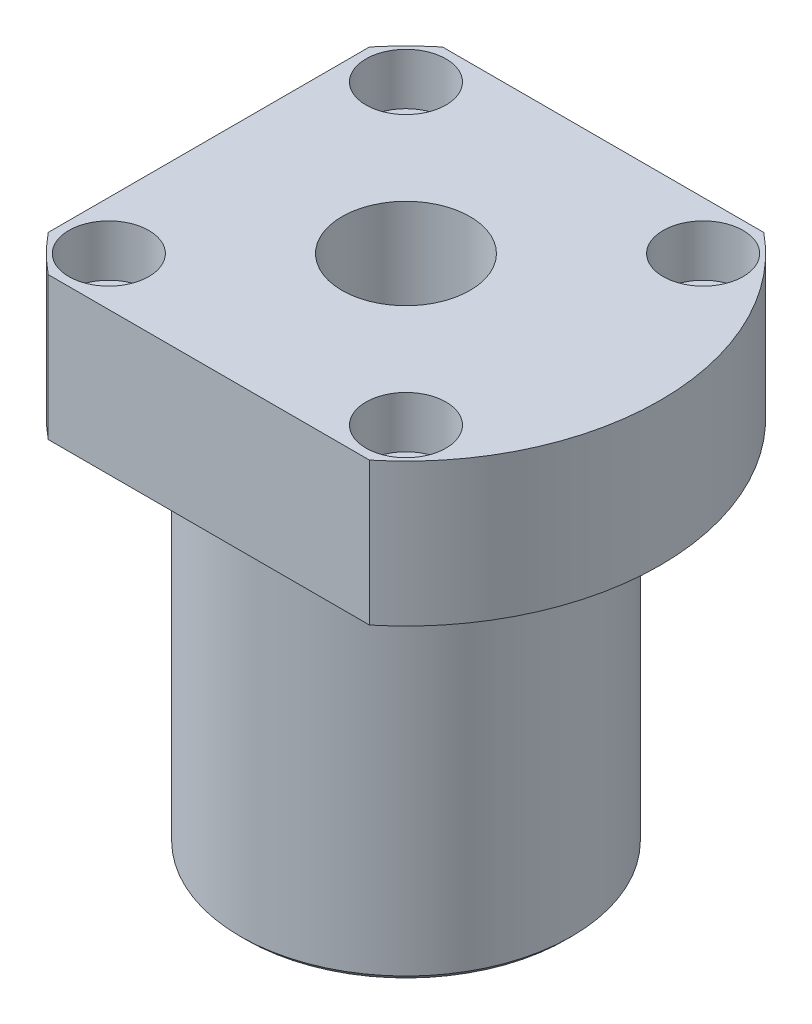
ISO-10303-21;
HEADER;
FILE_DESCRIPTION(('STEP AP214'),'2;1');
FILE_NAME('part.step','',(''),(''),'','','');
FILE_SCHEMA(('AUTOMOTIVE_DESIGN { 1 0 10303 214 1 1 1 1 }'));
ENDSEC;
DATA;
#1=APPLICATION_CONTEXT('core data for automotive mechanical design processes');
#2=APPLICATION_PROTOCOL_DEFINITION('international standard','automotive_design',2000,#1);
#3=PRODUCT_CONTEXT('',#1,'mechanical');
#4=PRODUCT('Part','Part','',(#3));
#5=PRODUCT_RELATED_PRODUCT_CATEGORY('part','',(#4));
#6=PRODUCT_DEFINITION_FORMATION('','',#4);
#7=PRODUCT_DEFINITION_CONTEXT('part definition',#1,'design');
#8=PRODUCT_DEFINITION('design','',#6,#7);
#9=PRODUCT_DEFINITION_SHAPE('','',#8);
#10=(LENGTH_UNIT() NAMED_UNIT(*) SI_UNIT(.MILLI.,.METRE.));
#11=(NAMED_UNIT(*) PLANE_ANGLE_UNIT() SI_UNIT($,.RADIAN.));
#12=(NAMED_UNIT(*) SI_UNIT($,.STERADIAN.) SOLID_ANGLE_UNIT());
#13=UNCERTAINTY_MEASURE_WITH_UNIT(LENGTH_MEASURE(1.E-05),#10,'distance_accuracy_value','');
#14=(GEOMETRIC_REPRESENTATION_CONTEXT(3) GLOBAL_UNCERTAINTY_ASSIGNED_CONTEXT((#13)) GLOBAL_UNIT_ASSIGNED_CONTEXT((#10,
#11,#12)) REPRESENTATION_CONTEXT('',''));
#15=CARTESIAN_POINT('',(0.,0.,0.));
#16=DIRECTION('',(0.,0.,1.));
#17=DIRECTION('',(1.,0.,0.));
#18=AXIS2_PLACEMENT_3D('',#15,#16,#17);
#19=CARTESIAN_POINT('',(0.,-47.6,0.));
#20=DIRECTION('',(0.,1.,0.));
#21=DIRECTION('',(0.,0.,1.));
#22=AXIS2_PLACEMENT_3D('',#19,#20,#21);
#23=PLANE('',#22);
#24=CARTESIAN_POINT('',(0.,-47.6,0.));
#25=DIRECTION('',(0.,1.,0.));
#26=DIRECTION('',(0.,0.,1.));
#27=AXIS2_PLACEMENT_3D('',#24,#25,#26);
#28=CIRCLE('',#27,20.);
#29=CARTESIAN_POINT('',(0.,-47.6,20.));
#30=VERTEX_POINT('',#29);
#31=EDGE_CURVE('E20',#30,#30,#28,.T.);
#32=ORIENTED_EDGE('',*,*,#31,.T.);
#33=EDGE_LOOP('',(#32));
#34=FACE_BOUND('',#33,.T.);
#35=ADVANCED_FACE('F17',(#34),#23,.T.);
#36=CARTESIAN_POINT('',(0.,-51.23,0.));
#37=DIRECTION('',(0.,1.,0.));
#38=DIRECTION('',(0.,0.,1.));
#39=AXIS2_PLACEMENT_3D('',#36,#37,#38);
#40=CYLINDRICAL_SURFACE('',#39,20.);
#41=ORIENTED_EDGE('',*,*,#31,.F.);
#42=EDGE_LOOP('',(#41));
#43=FACE_BOUND('',#42,.T.);
#44=CARTESIAN_POINT('',(0.,3.,0.));
#45=DIRECTION('',(0.,1.,0.));
#46=DIRECTION('',(0.,0.,1.));
#47=AXIS2_PLACEMENT_3D('',#44,#45,#46);
#48=CIRCLE('',#47,20.);
#49=CARTESIAN_POINT('',(0.,3.,20.));
#50=VERTEX_POINT('',#49);
#51=EDGE_CURVE('E201',#50,#50,#48,.T.);
#52=ORIENTED_EDGE('',*,*,#51,.T.);
#53=EDGE_LOOP('',(#52));
#54=FACE_BOUND('',#53,.T.);
#55=ADVANCED_FACE('F209',(#43,#54),#40,.F.);
#56=CARTESIAN_POINT('',(0.,3.,0.));
#57=DIRECTION('',(0.,1.,0.));
#58=DIRECTION('',(0.,0.,1.));
#59=AXIS2_PLACEMENT_3D('',#56,#57,#58);
#60=PLANE('',#59);
#61=CARTESIAN_POINT('',(0.,3.,0.));
#62=DIRECTION('',(0.,1.,0.));
#63=DIRECTION('',(0.,0.,1.));
#64=AXIS2_PLACEMENT_3D('',#61,#62,#63);
#65=CIRCLE('',#64,11.2);
#66=CARTESIAN_POINT('',(0.,3.,11.2));
#67=VERTEX_POINT('',#66);
#68=EDGE_CURVE('E199',#67,#67,#65,.T.);
#69=ORIENTED_EDGE('',*,*,#68,.T.);
#70=EDGE_LOOP('',(#69));
#71=FACE_BOUND('',#70,.T.);
#72=ORIENTED_EDGE('',*,*,#51,.F.);
#73=EDGE_LOOP('',(#72));
#74=FACE_BOUND('',#73,.T.);
#75=ADVANCED_FACE('F211',(#71,#74),#60,.F.);
#76=CARTESIAN_POINT('',(34.5,10.,-13.));
#77=DIRECTION('',(0.,1.,0.));
#78=DIRECTION('',(0.,0.,1.));
#79=AXIS2_PLACEMENT_3D('',#76,#77,#78);
#80=PLANE('',#79);
#81=CARTESIAN_POINT('',(34.5,10.,-13.));
#82=DIRECTION('',(0.,1.,0.));
#83=DIRECTION('',(0.,0.,1.));
#84=AXIS2_PLACEMENT_3D('',#81,#82,#83);
#85=CIRCLE('',#84,2.);
#86=CARTESIAN_POINT('',(34.5,10.,-11.));
#87=VERTEX_POINT('',#86);
#88=EDGE_CURVE('E95',#87,#87,#85,.F.);
#89=ORIENTED_EDGE('',*,*,#88,.T.);
#90=EDGE_LOOP('',(#89));
#91=FACE_BOUND('',#90,.T.);
#92=ADVANCED_FACE('F218',(#91),#80,.F.);
#93=CARTESIAN_POINT('',(34.5,10.,13.));
#94=DIRECTION('',(0.,-1.,0.));
#95=DIRECTION('',(0.,0.,-1.));
#96=AXIS2_PLACEMENT_3D('',#93,#94,#95);
#97=PLANE('',#96);
#98=CARTESIAN_POINT('',(34.5,10.,13.));
#99=DIRECTION('',(0.,-1.,0.));
#100=DIRECTION('',(0.,0.,-1.));
#101=AXIS2_PLACEMENT_3D('',#98,#99,#100);
#102=CIRCLE('',#101,2.);
#103=CARTESIAN_POINT('',(34.5,10.,11.));
#104=VERTEX_POINT('',#103);
#105=EDGE_CURVE('E89',#104,#104,#102,.T.);
#106=ORIENTED_EDGE('',*,*,#105,.T.);
#107=EDGE_LOOP('',(#106));
#108=FACE_BOUND('',#107,.T.);
#109=ADVANCED_FACE('F82',(#108),#97,.T.);
#110=CARTESIAN_POINT('',(16.85,-58.4999999999241,0.));
#111=DIRECTION('',(0.,-1.,0.));
#112=DIRECTION('',(0.,0.,-1.));
#113=AXIS2_PLACEMENT_3D('',#110,#111,#112);
#114=CONICAL_SURFACE('',#113,1.99999999980546,1.04719755105914);
#115=CARTESIAN_POINT('',(16.8500000002041,-57.3452994615877,0.));
#116=VERTEX_POINT('',#115);
#117=VERTEX_LOOP('',#116);
#118=FACE_BOUND('',#117,.T.);
#119=CARTESIAN_POINT('',(16.85,-58.5,0.));
#120=DIRECTION('',(0.,1.,0.));
#121=DIRECTION('',(0.,0.,1.));
#122=AXIS2_PLACEMENT_3D('',#119,#120,#121);
#123=CIRCLE('',#122,2.);
#124=CARTESIAN_POINT('',(16.85,-58.5,2.));
#125=VERTEX_POINT('',#124);
#126=EDGE_CURVE('E86',#125,#125,#123,.F.);
#127=ORIENTED_EDGE('',*,*,#126,.T.);
#128=EDGE_LOOP('',(#127));
#129=FACE_BOUND('',#128,.T.);
#130=ADVANCED_FACE('F78',(#118,#129),#114,.F.);
#131=CARTESIAN_POINT('',(-16.85,-58.4999999999809,0.));
#132=DIRECTION('',(0.,-1.,0.));
#133=DIRECTION('',(0.,0.,-1.));
#134=AXIS2_PLACEMENT_3D('',#131,#132,#133);
#135=CONICAL_SURFACE('',#134,1.99999999992942,1.04719755102096);
#136=CARTESIAN_POINT('',(-16.85,-58.5,0.));
#137=DIRECTION('',(0.,-1.,0.));
#138=DIRECTION('',(0.,0.,-1.));
#139=AXIS2_PLACEMENT_3D('',#136,#137,#138);
#140=CIRCLE('',#139,2.);
#141=CARTESIAN_POINT('',(-16.85,-58.5,-2.));
#142=VERTEX_POINT('',#141);
#143=EDGE_CURVE('E88',#142,#142,#140,.T.);
#144=ORIENTED_EDGE('',*,*,#143,.T.);
#145=EDGE_LOOP('',(#144));
#146=FACE_BOUND('',#145,.T.);
#147=CARTESIAN_POINT('',(-16.850000000261,-57.3452994615593,0.));
#148=VERTEX_POINT('',#147);
#149=VERTEX_LOOP('',#148);
#150=FACE_BOUND('',#149,.T.);
#151=ADVANCED_FACE('F81',(#146,#150),#135,.F.);
#152=CARTESIAN_POINT('',(0.,-51.23,0.));
#153=DIRECTION('',(0.,1.,0.));
#154=DIRECTION('',(0.,0.,1.));
#155=AXIS2_PLACEMENT_3D('',#152,#153,#154);
#156=CYLINDRICAL_SURFACE('',#155,11.2);
#157=ORIENTED_EDGE('',*,*,#68,.F.);
#158=EDGE_LOOP('',(#157));
#159=FACE_BOUND('',#158,.T.);
#160=CARTESIAN_POINT('',(0.,25.,0.));
#161=DIRECTION('',(0.,1.,0.));
#162=DIRECTION('',(0.,0.,1.));
#163=AXIS2_PLACEMENT_3D('',#160,#161,#162);
#164=CIRCLE('',#163,11.2);
#165=CARTESIAN_POINT('',(0.,25.,11.2));
#166=VERTEX_POINT('',#165);
#167=EDGE_CURVE('E92',#166,#166,#164,.F.);
#168=ORIENTED_EDGE('',*,*,#167,.F.);
#169=EDGE_LOOP('',(#168));
#170=FACE_BOUND('',#169,.T.);
#171=ADVANCED_FACE('F348',(#159,#170),#156,.F.);
#172=CARTESIAN_POINT('',(26.,-1.25,26.));
#173=DIRECTION('',(0.,1.,0.));
#174=DIRECTION('',(0.,0.,1.));
#175=AXIS2_PLACEMENT_3D('',#172,#173,#174);
#176=CYLINDRICAL_SURFACE('',#175,7.);
#177=CARTESIAN_POINT('',(26.,16.,26.));
#178=DIRECTION('',(0.,1.,0.));
#179=DIRECTION('',(0.,0.,1.));
#180=AXIS2_PLACEMENT_3D('',#177,#178,#179);
#181=CIRCLE('',#180,7.);
#182=CARTESIAN_POINT('',(26.,16.,33.));
#183=VERTEX_POINT('',#182);
#184=EDGE_CURVE('E180',#183,#183,#181,.T.);
#185=ORIENTED_EDGE('',*,*,#184,.F.);
#186=EDGE_LOOP('',(#185));
#187=FACE_BOUND('',#186,.T.);
#188=CARTESIAN_POINT('',(26.,25.,26.));
#189=DIRECTION('',(0.,1.,0.));
#190=DIRECTION('',(0.,0.,1.));
#191=AXIS2_PLACEMENT_3D('',#188,#189,#190);
#192=CIRCLE('',#191,7.);
#193=CARTESIAN_POINT('',(26.,25.,33.));
#194=VERTEX_POINT('',#193);
#195=EDGE_CURVE('E192',#194,#194,#192,.F.);
#196=ORIENTED_EDGE('',*,*,#195,.F.);
#197=EDGE_LOOP('',(#196));
#198=FACE_BOUND('',#197,.T.);
#199=ADVANCED_FACE('F344',(#187,#198),#176,.F.);
#200=CARTESIAN_POINT('',(26.,-1.25,-26.));
#201=DIRECTION('',(0.,-1.,0.));
#202=DIRECTION('',(0.,0.,-1.));
#203=AXIS2_PLACEMENT_3D('',#200,#201,#202);
#204=CYLINDRICAL_SURFACE('',#203,7.);
#205=CARTESIAN_POINT('',(26.,16.,-26.));
#206=DIRECTION('',(0.,-1.,0.));
#207=DIRECTION('',(0.,0.,-1.));
#208=AXIS2_PLACEMENT_3D('',#205,#206,#207);
#209=CIRCLE('',#208,7.);
#210=CARTESIAN_POINT('',(26.,16.,-33.));
#211=VERTEX_POINT('',#210);
#212=EDGE_CURVE('E177',#211,#211,#209,.T.);
#213=ORIENTED_EDGE('',*,*,#212,.T.);
#214=EDGE_LOOP('',(#213));
#215=FACE_BOUND('',#214,.T.);
#216=CARTESIAN_POINT('',(26.,25.,-26.));
#217=DIRECTION('',(0.,-1.,0.));
#218=DIRECTION('',(0.,0.,-1.));
#219=AXIS2_PLACEMENT_3D('',#216,#217,#218);
#220=CIRCLE('',#219,7.);
#221=CARTESIAN_POINT('',(26.,25.,-33.));
#222=VERTEX_POINT('',#221);
#223=EDGE_CURVE('E189',#222,#222,#220,.T.);
#224=ORIENTED_EDGE('',*,*,#223,.F.);
#225=EDGE_LOOP('',(#224));
#226=FACE_BOUND('',#225,.T.);
#227=ADVANCED_FACE('F340',(#215,#226),#204,.F.);
#228=CARTESIAN_POINT('',(-26.,-1.25,26.));
#229=DIRECTION('',(0.,-1.,0.));
#230=DIRECTION('',(0.,0.,-1.));
#231=AXIS2_PLACEMENT_3D('',#228,#229,#230);
#232=CYLINDRICAL_SURFACE('',#231,7.);
#233=CARTESIAN_POINT('',(-26.,16.,26.));
#234=DIRECTION('',(0.,-1.,0.));
#235=DIRECTION('',(0.,0.,-1.));
#236=AXIS2_PLACEMENT_3D('',#233,#234,#235);
#237=CIRCLE('',#236,7.);
#238=CARTESIAN_POINT('',(-26.,16.,19.));
#239=VERTEX_POINT('',#238);
#240=EDGE_CURVE('E174',#239,#239,#237,.T.);
#241=ORIENTED_EDGE('',*,*,#240,.T.);
#242=EDGE_LOOP('',(#241));
#243=FACE_BOUND('',#242,.T.);
#244=CARTESIAN_POINT('',(-26.,25.,26.));
#245=DIRECTION('',(0.,-1.,0.));
#246=DIRECTION('',(0.,0.,-1.));
#247=AXIS2_PLACEMENT_3D('',#244,#245,#246);
#248=CIRCLE('',#247,7.);
#249=CARTESIAN_POINT('',(-26.,25.,19.));
#250=VERTEX_POINT('',#249);
#251=EDGE_CURVE('E186',#250,#250,#248,.T.);
#252=ORIENTED_EDGE('',*,*,#251,.F.);
#253=EDGE_LOOP('',(#252));
#254=FACE_BOUND('',#253,.T.);
#255=ADVANCED_FACE('F336',(#243,#254),#232,.F.);
#256=CARTESIAN_POINT('',(-26.,-1.25,-26.));
#257=DIRECTION('',(0.,1.,0.));
#258=DIRECTION('',(0.,0.,1.));
#259=AXIS2_PLACEMENT_3D('',#256,#257,#258);
#260=CYLINDRICAL_SURFACE('',#259,7.);
#261=CARTESIAN_POINT('',(-26.,16.,-26.));
#262=DIRECTION('',(0.,1.,0.));
#263=DIRECTION('',(0.,0.,1.));
#264=AXIS2_PLACEMENT_3D('',#261,#262,#263);
#265=CIRCLE('',#264,7.);
#266=CARTESIAN_POINT('',(-26.,16.,-19.));
#267=VERTEX_POINT('',#266);
#268=EDGE_CURVE('E171',#267,#267,#265,.T.);
#269=ORIENTED_EDGE('',*,*,#268,.F.);
#270=EDGE_LOOP('',(#269));
#271=FACE_BOUND('',#270,.T.);
#272=CARTESIAN_POINT('',(-26.,25.,-26.));
#273=DIRECTION('',(0.,1.,0.));
#274=DIRECTION('',(0.,0.,1.));
#275=AXIS2_PLACEMENT_3D('',#272,#273,#274);
#276=CIRCLE('',#275,7.);
#277=CARTESIAN_POINT('',(-26.,25.,-19.));
#278=VERTEX_POINT('',#277);
#279=EDGE_CURVE('E183',#278,#278,#276,.F.);
#280=ORIENTED_EDGE('',*,*,#279,.F.);
#281=EDGE_LOOP('',(#280));
#282=FACE_BOUND('',#281,.T.);
#283=ADVANCED_FACE('F332',(#271,#282),#260,.F.);
#284=CARTESIAN_POINT('',(34.5,-0.5,-13.));
#285=DIRECTION('',(0.,1.,0.));
#286=DIRECTION('',(0.,0.,1.));
#287=AXIS2_PLACEMENT_3D('',#284,#285,#286);
#288=CYLINDRICAL_SURFACE('',#287,2.);
#289=ORIENTED_EDGE('',*,*,#88,.F.);
#290=EDGE_LOOP('',(#289));
#291=FACE_BOUND('',#290,.T.);
#292=CARTESIAN_POINT('',(34.5,1.5,-13.));
#293=DIRECTION('',(0.,1.,0.));
#294=DIRECTION('',(0.,0.,1.));
#295=AXIS2_PLACEMENT_3D('',#292,#293,#294);
#296=CIRCLE('',#295,2.);
#297=CARTESIAN_POINT('',(34.5,1.5,-11.));
#298=VERTEX_POINT('',#297);
#299=EDGE_CURVE('E168',#298,#298,#296,.F.);
#300=ORIENTED_EDGE('',*,*,#299,.T.);
#301=EDGE_LOOP('',(#300));
#302=FACE_BOUND('',#301,.T.);
#303=ADVANCED_FACE('F328',(#291,#302),#288,.F.);
#304=CARTESIAN_POINT('',(34.5,-0.5,13.));
#305=DIRECTION('',(0.,-1.,0.));
#306=DIRECTION('',(0.,0.,-1.));
#307=AXIS2_PLACEMENT_3D('',#304,#305,#306);
#308=CYLINDRICAL_SURFACE('',#307,2.);
#309=ORIENTED_EDGE('',*,*,#105,.F.);
#310=EDGE_LOOP('',(#309));
#311=FACE_BOUND('',#310,.T.);
#312=CARTESIAN_POINT('',(34.5,1.5,13.));
#313=DIRECTION('',(0.,-1.,0.));
#314=DIRECTION('',(0.,0.,-1.));
#315=AXIS2_PLACEMENT_3D('',#312,#313,#314);
#316=CIRCLE('',#315,2.);
#317=CARTESIAN_POINT('',(34.5,1.5,11.));
#318=VERTEX_POINT('',#317);
#319=EDGE_CURVE('E165',#318,#318,#316,.F.);
#320=ORIENTED_EDGE('',*,*,#319,.F.);
#321=EDGE_LOOP('',(#320));
#322=FACE_BOUND('',#321,.T.);
#323=ADVANCED_FACE('F325',(#311,#322),#308,.F.);
#324=CARTESIAN_POINT('',(16.85,-65.38273502692,0.));
#325=DIRECTION('',(0.,1.,0.));
#326=DIRECTION('',(0.,0.,1.));
#327=AXIS2_PLACEMENT_3D('',#324,#325,#326);
#328=CYLINDRICAL_SURFACE('',#327,2.);
#329=ORIENTED_EDGE('',*,*,#126,.F.);
#330=EDGE_LOOP('',(#329));
#331=FACE_BOUND('',#330,.T.);
#332=CARTESIAN_POINT('',(16.85,-65.,0.));
#333=DIRECTION('',(0.,1.,0.));
#334=DIRECTION('',(0.,0.,1.));
#335=AXIS2_PLACEMENT_3D('',#332,#333,#334);
#336=CIRCLE('',#335,2.);
#337=CARTESIAN_POINT('',(16.85,-65.,2.));
#338=VERTEX_POINT('',#337);
#339=EDGE_CURVE('E162',#338,#338,#336,.F.);
#340=ORIENTED_EDGE('',*,*,#339,.T.);
#341=EDGE_LOOP('',(#340));
#342=FACE_BOUND('',#341,.T.);
#343=ADVANCED_FACE('F321',(#331,#342),#328,.F.);
#344=CARTESIAN_POINT('',(-16.85,-65.38273502692,0.));
#345=DIRECTION('',(0.,-1.,0.));
#346=DIRECTION('',(0.,0.,-1.));
#347=AXIS2_PLACEMENT_3D('',#344,#345,#346);
#348=CYLINDRICAL_SURFACE('',#347,2.);
#349=ORIENTED_EDGE('',*,*,#143,.F.);
#350=EDGE_LOOP('',(#349));
#351=FACE_BOUND('',#350,.T.);
#352=CARTESIAN_POINT('',(-16.85,-65.,0.));
#353=DIRECTION('',(0.,-1.,0.));
#354=DIRECTION('',(0.,0.,-1.));
#355=AXIS2_PLACEMENT_3D('',#352,#353,#354);
#356=CIRCLE('',#355,2.);
#357=CARTESIAN_POINT('',(-16.85,-65.,-2.));
#358=VERTEX_POINT('',#357);
#359=EDGE_CURVE('E159',#358,#358,#356,.T.);
#360=ORIENTED_EDGE('',*,*,#359,.T.);
#361=EDGE_LOOP('',(#360));
#362=FACE_BOUND('',#361,.T.);
#363=ADVANCED_FACE('F317',(#351,#362),#348,.F.);
#364=CARTESIAN_POINT('',(0.,25.,0.));
#365=DIRECTION('',(0.,1.,0.));
#366=DIRECTION('',(0.,0.,1.));
#367=AXIS2_PLACEMENT_3D('',#364,#365,#366);
#368=PLANE('',#367);
#369=ORIENTED_EDGE('',*,*,#279,.T.);
#370=EDGE_LOOP('',(#369));
#371=FACE_BOUND('',#370,.T.);
#372=ORIENTED_EDGE('',*,*,#251,.T.);
#373=EDGE_LOOP('',(#372));
#374=FACE_BOUND('',#373,.T.);
#375=ORIENTED_EDGE('',*,*,#223,.T.);
#376=EDGE_LOOP('',(#375));
#377=FACE_BOUND('',#376,.T.);
#378=ORIENTED_EDGE('',*,*,#195,.T.);
#379=EDGE_LOOP('',(#378));
#380=FACE_BOUND('',#379,.T.);
#381=ORIENTED_EDGE('',*,*,#167,.T.);
#382=EDGE_LOOP('',(#381));
#383=FACE_BOUND('',#382,.T.);
#384=DIRECTION('',(-1.,0.,0.));
#385=VECTOR('',#384,1.);
#386=CARTESIAN_POINT('',(28.11306135489,25.,-34.5));
#387=LINE('',#386,#385);
#388=CARTESIAN_POINT('',(-28.1069386451102,25.,-34.5));
#389=VERTEX_POINT('',#388);
#390=CARTESIAN_POINT('',(28.113061354893,25.,-34.5));
#391=VERTEX_POINT('',#390);
#392=EDGE_CURVE('E396',#389,#391,#387,.F.);
#393=ORIENTED_EDGE('',*,*,#392,.F.);
#394=CARTESIAN_POINT('',(0.,25.,0.));
#395=DIRECTION('',(0.,1.,0.));
#396=DIRECTION('',(0.,0.,1.));
#397=AXIS2_PLACEMENT_3D('',#394,#395,#396);
#398=CIRCLE('',#397,44.5);
#399=CARTESIAN_POINT('',(-34.5,25.,-28.1069386451102));
#400=VERTEX_POINT('',#399);
#401=EDGE_CURVE('E70',#400,#389,#398,.F.);
#402=ORIENTED_EDGE('',*,*,#401,.F.);
#403=DIRECTION('',(0.,0.,1.));
#404=VECTOR('',#403,1.);
#405=CARTESIAN_POINT('',(-34.5,25.,-28.10693864511));
#406=LINE('',#405,#404);
#407=CARTESIAN_POINT('',(-34.5,25.,28.1069386451102));
#408=VERTEX_POINT('',#407);
#409=EDGE_CURVE('E158',#408,#400,#406,.F.);
#410=ORIENTED_EDGE('',*,*,#409,.F.);
#411=CARTESIAN_POINT('',(0.,25.,0.));
#412=DIRECTION('',(0.,1.,0.));
#413=DIRECTION('',(0.,0.,1.));
#414=AXIS2_PLACEMENT_3D('',#411,#412,#413);
#415=CIRCLE('',#414,44.5);
#416=CARTESIAN_POINT('',(-28.1069386451102,25.,34.5));
#417=VERTEX_POINT('',#416);
#418=EDGE_CURVE('E152',#417,#408,#415,.F.);
#419=ORIENTED_EDGE('',*,*,#418,.F.);
#420=DIRECTION('',(1.,0.,0.));
#421=VECTOR('',#420,1.);
#422=CARTESIAN_POINT('',(-28.10693864511,25.,34.5));
#423=LINE('',#422,#421);
#424=CARTESIAN_POINT('',(28.1130613548943,25.,34.5000000000015));
#425=VERTEX_POINT('',#424);
#426=EDGE_CURVE('E402',#425,#417,#423,.F.);
#427=ORIENTED_EDGE('',*,*,#426,.F.);
#428=CARTESIAN_POINT('',(0.,25.,0.));
#429=DIRECTION('',(0.,1.,0.));
#430=DIRECTION('',(0.,0.,1.));
#431=AXIS2_PLACEMENT_3D('',#428,#429,#430);
#432=CIRCLE('',#431,44.50386745828);
#433=EDGE_CURVE('E147',#391,#425,#432,.F.);
#434=ORIENTED_EDGE('',*,*,#433,.F.);
#435=EDGE_LOOP('',(#393,#402,#410,#419,#427,#434));
#436=FACE_BOUND('',#435,.T.);
#437=ADVANCED_FACE('F313',(#371,#374,#377,#380,#383,#436),#368,.T.);
#438=CARTESIAN_POINT('',(26.,16.,26.));
#439=DIRECTION('',(0.,1.,0.));
#440=DIRECTION('',(0.,0.,1.));
#441=AXIS2_PLACEMENT_3D('',#438,#439,#440);
#442=PLANE('',#441);
#443=CARTESIAN_POINT('',(26.,16.,26.));
#444=DIRECTION('',(0.,1.,0.));
#445=DIRECTION('',(0.,0.,1.));
#446=AXIS2_PLACEMENT_3D('',#443,#444,#445);
#447=CIRCLE('',#446,4.5);
#448=CARTESIAN_POINT('',(26.,16.,30.5));
#449=VERTEX_POINT('',#448);
#450=EDGE_CURVE('E143',#449,#449,#447,.F.);
#451=ORIENTED_EDGE('',*,*,#450,.T.);
#452=EDGE_LOOP('',(#451));
#453=FACE_BOUND('',#452,.T.);
#454=ORIENTED_EDGE('',*,*,#184,.T.);
#455=EDGE_LOOP('',(#454));
#456=FACE_BOUND('',#455,.T.);
#457=ADVANCED_FACE('F309',(#453,#456),#442,.T.);
#458=CARTESIAN_POINT('',(26.,16.,-26.));
#459=DIRECTION('',(0.,-1.,0.));
#460=DIRECTION('',(0.,0.,-1.));
#461=AXIS2_PLACEMENT_3D('',#458,#459,#460);
#462=PLANE('',#461);
#463=CARTESIAN_POINT('',(26.,16.,-26.));
#464=DIRECTION('',(0.,-1.,0.));
#465=DIRECTION('',(0.,0.,-1.));
#466=AXIS2_PLACEMENT_3D('',#463,#464,#465);
#467=CIRCLE('',#466,4.5);
#468=CARTESIAN_POINT('',(26.,16.,-30.5));
#469=VERTEX_POINT('',#468);
#470=EDGE_CURVE('E140',#469,#469,#467,.T.);
#471=ORIENTED_EDGE('',*,*,#470,.T.);
#472=EDGE_LOOP('',(#471));
#473=FACE_BOUND('',#472,.T.);
#474=ORIENTED_EDGE('',*,*,#212,.F.);
#475=EDGE_LOOP('',(#474));
#476=FACE_BOUND('',#475,.T.);
#477=ADVANCED_FACE('F305',(#473,#476),#462,.F.);
#478=CARTESIAN_POINT('',(-26.,16.,26.));
#479=DIRECTION('',(0.,-1.,0.));
#480=DIRECTION('',(0.,0.,-1.));
#481=AXIS2_PLACEMENT_3D('',#478,#479,#480);
#482=PLANE('',#481);
#483=CARTESIAN_POINT('',(-26.,16.,26.));
#484=DIRECTION('',(0.,-1.,0.));
#485=DIRECTION('',(0.,0.,-1.));
#486=AXIS2_PLACEMENT_3D('',#483,#484,#485);
#487=CIRCLE('',#486,4.5);
#488=CARTESIAN_POINT('',(-26.,16.,21.5));
#489=VERTEX_POINT('',#488);
#490=EDGE_CURVE('E137',#489,#489,#487,.T.);
#491=ORIENTED_EDGE('',*,*,#490,.T.);
#492=EDGE_LOOP('',(#491));
#493=FACE_BOUND('',#492,.T.);
#494=ORIENTED_EDGE('',*,*,#240,.F.);
#495=EDGE_LOOP('',(#494));
#496=FACE_BOUND('',#495,.T.);
#497=ADVANCED_FACE('F301',(#493,#496),#482,.F.);
#498=CARTESIAN_POINT('',(-26.,16.,-26.));
#499=DIRECTION('',(0.,1.,0.));
#500=DIRECTION('',(0.,0.,1.));
#501=AXIS2_PLACEMENT_3D('',#498,#499,#500);
#502=PLANE('',#501);
#503=CARTESIAN_POINT('',(-26.,16.,-26.));
#504=DIRECTION('',(0.,1.,0.));
#505=DIRECTION('',(0.,0.,1.));
#506=AXIS2_PLACEMENT_3D('',#503,#504,#505);
#507=CIRCLE('',#506,4.5);
#508=CARTESIAN_POINT('',(-26.,16.,-21.5));
#509=VERTEX_POINT('',#508);
#510=EDGE_CURVE('E134',#509,#509,#507,.F.);
#511=ORIENTED_EDGE('',*,*,#510,.T.);
#512=EDGE_LOOP('',(#511));
#513=FACE_BOUND('',#512,.T.);
#514=ORIENTED_EDGE('',*,*,#268,.T.);
#515=EDGE_LOOP('',(#514));
#516=FACE_BOUND('',#515,.T.);
#517=ADVANCED_FACE('F297',(#513,#516),#502,.T.);
#518=CARTESIAN_POINT('',(34.5,1.5,-13.));
#519=DIRECTION('',(0.,1.,0.));
#520=DIRECTION('',(0.,0.,1.));
#521=AXIS2_PLACEMENT_3D('',#518,#519,#520);
#522=PLANE('',#521);
#523=ORIENTED_EDGE('',*,*,#299,.F.);
#524=EDGE_LOOP('',(#523));
#525=FACE_BOUND('',#524,.T.);
#526=CARTESIAN_POINT('',(34.5,1.5,-13.));
#527=DIRECTION('',(0.,1.,0.));
#528=DIRECTION('',(0.,0.,1.));
#529=AXIS2_PLACEMENT_3D('',#526,#527,#528);
#530=CIRCLE('',#529,6.);
#531=CARTESIAN_POINT('',(34.5,1.5,-7.));
#532=VERTEX_POINT('',#531);
#533=EDGE_CURVE('E131',#532,#532,#530,.F.);
#534=ORIENTED_EDGE('',*,*,#533,.T.);
#535=EDGE_LOOP('',(#534));
#536=FACE_BOUND('',#535,.T.);
#537=ADVANCED_FACE('F293',(#525,#536),#522,.F.);
#538=CARTESIAN_POINT('',(34.5,1.5,13.));
#539=DIRECTION('',(0.,-1.,0.));
#540=DIRECTION('',(0.,0.,-1.));
#541=AXIS2_PLACEMENT_3D('',#538,#539,#540);
#542=PLANE('',#541);
#543=ORIENTED_EDGE('',*,*,#319,.T.);
#544=EDGE_LOOP('',(#543));
#545=FACE_BOUND('',#544,.T.);
#546=CARTESIAN_POINT('',(34.5,1.5,13.));
#547=DIRECTION('',(0.,-1.,0.));
#548=DIRECTION('',(0.,0.,-1.));
#549=AXIS2_PLACEMENT_3D('',#546,#547,#548);
#550=CIRCLE('',#549,6.);
#551=CARTESIAN_POINT('',(34.5,1.5,7.));
#552=VERTEX_POINT('',#551);
#553=EDGE_CURVE('E128',#552,#552,#550,.T.);
#554=ORIENTED_EDGE('',*,*,#553,.T.);
#555=EDGE_LOOP('',(#554));
#556=FACE_BOUND('',#555,.T.);
#557=ADVANCED_FACE('F289',(#545,#556),#542,.T.);
#558=CARTESIAN_POINT('',(0.,-65.,0.));
#559=DIRECTION('',(0.,1.,0.));
#560=DIRECTION('',(0.,0.,1.));
#561=AXIS2_PLACEMENT_3D('',#558,#559,#560);
#562=PLANE('',#561);
#563=ORIENTED_EDGE('',*,*,#359,.F.);
#564=EDGE_LOOP('',(#563));
#565=FACE_BOUND('',#564,.T.);
#566=ORIENTED_EDGE('',*,*,#339,.F.);
#567=EDGE_LOOP('',(#566));
#568=FACE_BOUND('',#567,.T.);
#569=CARTESIAN_POINT('',(0.,-65.,0.));
#570=DIRECTION('',(0.,1.,0.));
#571=DIRECTION('',(0.,0.,1.));
#572=AXIS2_PLACEMENT_3D('',#569,#570,#571);
#573=CIRCLE('',#572,28.);
#574=CARTESIAN_POINT('',(0.,-65.,28.));
#575=VERTEX_POINT('',#574);
#576=EDGE_CURVE('E125',#575,#575,#573,.T.);
#577=ORIENTED_EDGE('',*,*,#576,.F.);
#578=EDGE_LOOP('',(#577));
#579=FACE_BOUND('',#578,.T.);
#580=ADVANCED_FACE('F285',(#565,#568,#579),#562,.F.);
#581=CARTESIAN_POINT('',(0.,0.,0.));
#582=DIRECTION('',(0.,1.,0.));
#583=DIRECTION('',(0.,0.,1.));
#584=AXIS2_PLACEMENT_3D('',#581,#582,#583);
#585=CYLINDRICAL_SURFACE('',#584,44.5);
#586=DIRECTION('',(0.,1.,0.));
#587=VECTOR('',#586,1.);
#588=CARTESIAN_POINT('',(-28.10693864511,0.,-34.5));
#589=LINE('',#588,#587);
#590=CARTESIAN_POINT('',(-28.1069386451102,0.,-34.5));
#591=VERTEX_POINT('',#590);
#592=EDGE_CURVE('E397',#591,#389,#589,.T.);
#593=ORIENTED_EDGE('',*,*,#592,.F.);
#594=CARTESIAN_POINT('',(0.,0.,0.));
#595=DIRECTION('',(0.,1.,0.));
#596=DIRECTION('',(0.,0.,1.));
#597=AXIS2_PLACEMENT_3D('',#594,#595,#596);
#598=CIRCLE('',#597,44.5);
#599=CARTESIAN_POINT('',(-34.5,0.,-28.1069386451102));
#600=VERTEX_POINT('',#599);
#601=EDGE_CURVE('E123',#591,#600,#598,.T.);
#602=ORIENTED_EDGE('',*,*,#601,.T.);
#603=DIRECTION('',(0.,1.,0.));
#604=VECTOR('',#603,1.);
#605=CARTESIAN_POINT('',(-34.5,0.,-28.10693864511));
#606=LINE('',#605,#604);
#607=EDGE_CURVE('E156',#400,#600,#606,.F.);
#608=ORIENTED_EDGE('',*,*,#607,.F.);
#609=ORIENTED_EDGE('',*,*,#401,.T.);
#610=EDGE_LOOP('',(#593,#602,#608,#609));
#611=FACE_BOUND('',#610,.T.);
#612=ADVANCED_FACE('F281',(#611),#585,.T.);
#613=CARTESIAN_POINT('',(-34.5,0.,-28.10693864511));
#614=DIRECTION('',(-1.,0.,0.));
#615=DIRECTION('',(0.,0.,1.));
#616=AXIS2_PLACEMENT_3D('',#613,#614,#615);
#617=PLANE('',#616);
#618=ORIENTED_EDGE('',*,*,#607,.T.);
#619=DIRECTION('',(0.,0.,1.));
#620=VECTOR('',#619,1.);
#621=CARTESIAN_POINT('',(-34.5,0.,0.));
#622=LINE('',#621,#620);
#623=CARTESIAN_POINT('',(-34.5,0.,28.1069386451102));
#624=VERTEX_POINT('',#623);
#625=EDGE_CURVE('E122',#600,#624,#622,.T.);
#626=ORIENTED_EDGE('',*,*,#625,.T.);
#627=DIRECTION('',(0.,1.,0.));
#628=VECTOR('',#627,1.);
#629=CARTESIAN_POINT('',(-34.5,0.,28.1069386451102));
#630=LINE('',#629,#628);
#631=EDGE_CURVE('E155',#408,#624,#630,.F.);
#632=ORIENTED_EDGE('',*,*,#631,.F.);
#633=ORIENTED_EDGE('',*,*,#409,.T.);
#634=EDGE_LOOP('',(#618,#626,#632,#633));
#635=FACE_BOUND('',#634,.T.);
#636=ADVANCED_FACE('F277',(#635),#617,.T.);
#637=CARTESIAN_POINT('',(0.,0.,0.));
#638=DIRECTION('',(0.,1.,0.));
#639=DIRECTION('',(0.,0.,1.));
#640=AXIS2_PLACEMENT_3D('',#637,#638,#639);
#641=CYLINDRICAL_SURFACE('',#640,44.5);
#642=ORIENTED_EDGE('',*,*,#631,.T.);
#643=CARTESIAN_POINT('',(0.,0.,0.));
#644=DIRECTION('',(0.,1.,0.));
#645=DIRECTION('',(0.,0.,1.));
#646=AXIS2_PLACEMENT_3D('',#643,#644,#645);
#647=CIRCLE('',#646,44.5);
#648=CARTESIAN_POINT('',(-28.1069386451102,0.,34.5));
#649=VERTEX_POINT('',#648);
#650=EDGE_CURVE('E120',#624,#649,#647,.T.);
#651=ORIENTED_EDGE('',*,*,#650,.T.);
#652=DIRECTION('',(0.,1.,0.));
#653=VECTOR('',#652,1.);
#654=CARTESIAN_POINT('',(-28.10693864511,0.,34.5));
#655=LINE('',#654,#653);
#656=EDGE_CURVE('E151',#417,#649,#655,.F.);
#657=ORIENTED_EDGE('',*,*,#656,.F.);
#658=ORIENTED_EDGE('',*,*,#418,.T.);
#659=EDGE_LOOP('',(#642,#651,#657,#658));
#660=FACE_BOUND('',#659,.T.);
#661=ADVANCED_FACE('F273',(#660),#641,.T.);
#662=CARTESIAN_POINT('',(-28.10693864511,0.,34.5));
#663=DIRECTION('',(0.,0.,1.));
#664=DIRECTION('',(1.,0.,0.));
#665=AXIS2_PLACEMENT_3D('',#662,#663,#664);
#666=PLANE('',#665);
#667=ORIENTED_EDGE('',*,*,#656,.T.);
#668=DIRECTION('',(1.,0.,0.));
#669=VECTOR('',#668,1.);
#670=CARTESIAN_POINT('',(0.,0.,34.5));
#671=LINE('',#670,#669);
#672=CARTESIAN_POINT('',(28.1130613548943,0.,34.5000000000015));
#673=VERTEX_POINT('',#672);
#674=EDGE_CURVE('E119',#649,#673,#671,.T.);
#675=ORIENTED_EDGE('',*,*,#674,.T.);
#676=DIRECTION('',(0.,1.,0.));
#677=VECTOR('',#676,1.);
#678=CARTESIAN_POINT('',(28.1130613548925,0.,34.500000000003));
#679=LINE('',#678,#677);
#680=EDGE_CURVE('E150',#425,#673,#679,.F.);
#681=ORIENTED_EDGE('',*,*,#680,.F.);
#682=ORIENTED_EDGE('',*,*,#426,.T.);
#683=EDGE_LOOP('',(#667,#675,#681,#682));
#684=FACE_BOUND('',#683,.T.);
#685=ADVANCED_FACE('F270',(#684),#666,.T.);
#686=CARTESIAN_POINT('',(0.,0.,0.));
#687=DIRECTION('',(0.,1.,0.));
#688=DIRECTION('',(0.,0.,1.));
#689=AXIS2_PLACEMENT_3D('',#686,#687,#688);
#690=CYLINDRICAL_SURFACE('',#689,44.50386745828);
#691=ORIENTED_EDGE('',*,*,#680,.T.);
#692=CARTESIAN_POINT('',(0.,0.,0.));
#693=DIRECTION('',(0.,1.,0.));
#694=DIRECTION('',(0.,0.,1.));
#695=AXIS2_PLACEMENT_3D('',#692,#693,#694);
#696=CIRCLE('',#695,44.50386745828);
#697=CARTESIAN_POINT('',(28.113061354893,0.,-34.5));
#698=VERTEX_POINT('',#697);
#699=EDGE_CURVE('E35',#673,#698,#696,.T.);
#700=ORIENTED_EDGE('',*,*,#699,.T.);
#701=DIRECTION('',(0.,1.,0.));
#702=VECTOR('',#701,1.);
#703=CARTESIAN_POINT('',(28.11306135489,0.,-34.5));
#704=LINE('',#703,#702);
#705=EDGE_CURVE('E146',#391,#698,#704,.F.);
#706=ORIENTED_EDGE('',*,*,#705,.F.);
#707=ORIENTED_EDGE('',*,*,#433,.T.);
#708=EDGE_LOOP('',(#691,#700,#706,#707));
#709=FACE_BOUND('',#708,.T.);
#710=ADVANCED_FACE('F266',(#709),#690,.T.);
#711=CARTESIAN_POINT('',(28.11306135489,0.,-34.5));
#712=DIRECTION('',(0.,0.,-1.));
#713=DIRECTION('',(-1.,0.,0.));
#714=AXIS2_PLACEMENT_3D('',#711,#712,#713);
#715=PLANE('',#714);
#716=ORIENTED_EDGE('',*,*,#705,.T.);
#717=DIRECTION('',(1.,0.,0.));
#718=VECTOR('',#717,1.);
#719=CARTESIAN_POINT('',(0.,0.,-34.5));
#720=LINE('',#719,#718);
#721=EDGE_CURVE('E117',#698,#591,#720,.F.);
#722=ORIENTED_EDGE('',*,*,#721,.T.);
#723=ORIENTED_EDGE('',*,*,#592,.T.);
#724=ORIENTED_EDGE('',*,*,#392,.T.);
#725=EDGE_LOOP('',(#716,#722,#723,#724));
#726=FACE_BOUND('',#725,.T.);
#727=ADVANCED_FACE('F262',(#726),#715,.T.);
#728=CARTESIAN_POINT('',(26.,-1.25,26.));
#729=DIRECTION('',(0.,1.,0.));
#730=DIRECTION('',(0.,0.,1.));
#731=AXIS2_PLACEMENT_3D('',#728,#729,#730);
#732=CYLINDRICAL_SURFACE('',#731,4.5);
#733=ORIENTED_EDGE('',*,*,#450,.F.);
#734=EDGE_LOOP('',(#733));
#735=FACE_BOUND('',#734,.T.);
#736=CARTESIAN_POINT('',(26.,0.,26.));
#737=DIRECTION('',(0.,1.,0.));
#738=DIRECTION('',(0.,0.,1.));
#739=AXIS2_PLACEMENT_3D('',#736,#737,#738);
#740=CIRCLE('',#739,4.5);
#741=CARTESIAN_POINT('',(26.,0.,30.5));
#742=VERTEX_POINT('',#741);
#743=EDGE_CURVE('E114',#742,#742,#740,.F.);
#744=ORIENTED_EDGE('',*,*,#743,.T.);
#745=EDGE_LOOP('',(#744));
#746=FACE_BOUND('',#745,.T.);
#747=ADVANCED_FACE('F258',(#735,#746),#732,.F.);
#748=CARTESIAN_POINT('',(26.,-1.25,-26.));
#749=DIRECTION('',(0.,-1.,0.));
#750=DIRECTION('',(0.,0.,-1.));
#751=AXIS2_PLACEMENT_3D('',#748,#749,#750);
#752=CYLINDRICAL_SURFACE('',#751,4.5);
#753=ORIENTED_EDGE('',*,*,#470,.F.);
#754=EDGE_LOOP('',(#753));
#755=FACE_BOUND('',#754,.T.);
#756=CARTESIAN_POINT('',(26.,0.,-26.));
#757=DIRECTION('',(0.,-1.,0.));
#758=DIRECTION('',(0.,0.,-1.));
#759=AXIS2_PLACEMENT_3D('',#756,#757,#758);
#760=CIRCLE('',#759,4.5);
#761=CARTESIAN_POINT('',(26.,0.,-30.5));
#762=VERTEX_POINT('',#761);
#763=EDGE_CURVE('E111',#762,#762,#760,.T.);
#764=ORIENTED_EDGE('',*,*,#763,.T.);
#765=EDGE_LOOP('',(#764));
#766=FACE_BOUND('',#765,.T.);
#767=ADVANCED_FACE('F254',(#755,#766),#752,.F.);
#768=CARTESIAN_POINT('',(-26.,-1.25,26.));
#769=DIRECTION('',(0.,-1.,0.));
#770=DIRECTION('',(0.,0.,-1.));
#771=AXIS2_PLACEMENT_3D('',#768,#769,#770);
#772=CYLINDRICAL_SURFACE('',#771,4.5);
#773=ORIENTED_EDGE('',*,*,#490,.F.);
#774=EDGE_LOOP('',(#773));
#775=FACE_BOUND('',#774,.T.);
#776=CARTESIAN_POINT('',(-26.,0.,26.));
#777=DIRECTION('',(0.,-1.,0.));
#778=DIRECTION('',(0.,0.,-1.));
#779=AXIS2_PLACEMENT_3D('',#776,#777,#778);
#780=CIRCLE('',#779,4.5);
#781=CARTESIAN_POINT('',(-26.,0.,21.5));
#782=VERTEX_POINT('',#781);
#783=EDGE_CURVE('E108',#782,#782,#780,.T.);
#784=ORIENTED_EDGE('',*,*,#783,.T.);
#785=EDGE_LOOP('',(#784));
#786=FACE_BOUND('',#785,.T.);
#787=ADVANCED_FACE('F250',(#775,#786),#772,.F.);
#788=CARTESIAN_POINT('',(-26.,-1.25,-26.));
#789=DIRECTION('',(0.,1.,0.));
#790=DIRECTION('',(0.,0.,1.));
#791=AXIS2_PLACEMENT_3D('',#788,#789,#790);
#792=CYLINDRICAL_SURFACE('',#791,4.5);
#793=ORIENTED_EDGE('',*,*,#510,.F.);
#794=EDGE_LOOP('',(#793));
#795=FACE_BOUND('',#794,.T.);
#796=CARTESIAN_POINT('',(-26.,0.,-26.));
#797=DIRECTION('',(0.,1.,0.));
#798=DIRECTION('',(0.,0.,1.));
#799=AXIS2_PLACEMENT_3D('',#796,#797,#798);
#800=CIRCLE('',#799,4.5);
#801=CARTESIAN_POINT('',(-26.,0.,-21.5));
#802=VERTEX_POINT('',#801);
#803=EDGE_CURVE('E105',#802,#802,#800,.F.);
#804=ORIENTED_EDGE('',*,*,#803,.T.);
#805=EDGE_LOOP('',(#804));
#806=FACE_BOUND('',#805,.T.);
#807=ADVANCED_FACE('F246',(#795,#806),#792,.F.);
#808=CARTESIAN_POINT('',(34.5,-0.5,-13.));
#809=DIRECTION('',(0.,1.,0.));
#810=DIRECTION('',(0.,0.,1.));
#811=AXIS2_PLACEMENT_3D('',#808,#809,#810);
#812=CYLINDRICAL_SURFACE('',#811,6.);
#813=ORIENTED_EDGE('',*,*,#533,.F.);
#814=EDGE_LOOP('',(#813));
#815=FACE_BOUND('',#814,.T.);
#816=CARTESIAN_POINT('',(34.5,0.,-13.));
#817=DIRECTION('',(0.,1.,0.));
#818=DIRECTION('',(0.,0.,1.));
#819=AXIS2_PLACEMENT_3D('',#816,#817,#818);
#820=CIRCLE('',#819,6.);
#821=CARTESIAN_POINT('',(34.5,0.,-7.));
#822=VERTEX_POINT('',#821);
#823=EDGE_CURVE('E102',#822,#822,#820,.F.);
#824=ORIENTED_EDGE('',*,*,#823,.T.);
#825=EDGE_LOOP('',(#824));
#826=FACE_BOUND('',#825,.T.);
#827=ADVANCED_FACE('F242',(#815,#826),#812,.F.);
#828=CARTESIAN_POINT('',(34.5,-0.5,13.));
#829=DIRECTION('',(0.,-1.,0.));
#830=DIRECTION('',(0.,0.,-1.));
#831=AXIS2_PLACEMENT_3D('',#828,#829,#830);
#832=CYLINDRICAL_SURFACE('',#831,6.);
#833=ORIENTED_EDGE('',*,*,#553,.F.);
#834=EDGE_LOOP('',(#833));
#835=FACE_BOUND('',#834,.T.);
#836=CARTESIAN_POINT('',(34.5,0.,13.));
#837=DIRECTION('',(0.,-1.,0.));
#838=DIRECTION('',(0.,0.,-1.));
#839=AXIS2_PLACEMENT_3D('',#836,#837,#838);
#840=CIRCLE('',#839,6.);
#841=CARTESIAN_POINT('',(34.5,0.,7.));
#842=VERTEX_POINT('',#841);
#843=EDGE_CURVE('E99',#842,#842,#840,.T.);
#844=ORIENTED_EDGE('',*,*,#843,.T.);
#845=EDGE_LOOP('',(#844));
#846=FACE_BOUND('',#845,.T.);
#847=ADVANCED_FACE('F238',(#835,#846),#832,.F.);
#848=CARTESIAN_POINT('',(0.,-64.,0.));
#849=DIRECTION('',(0.,1.,0.));
#850=DIRECTION('',(0.,0.,1.));
#851=AXIS2_PLACEMENT_3D('',#848,#849,#850);
#852=CONICAL_SURFACE('',#851,29.,0.785398163397299);
#853=CARTESIAN_POINT('',(0.,-64.,0.));
#854=DIRECTION('',(0.,1.,0.));
#855=DIRECTION('',(0.,0.,1.));
#856=AXIS2_PLACEMENT_3D('',#853,#854,#855);
#857=CIRCLE('',#856,29.);
#858=CARTESIAN_POINT('',(0.,-64.,29.));
#859=VERTEX_POINT('',#858);
#860=EDGE_CURVE('E26',#859,#859,#857,.T.);
#861=ORIENTED_EDGE('',*,*,#860,.F.);
#862=EDGE_LOOP('',(#861));
#863=FACE_BOUND('',#862,.T.);
#864=ORIENTED_EDGE('',*,*,#576,.T.);
#865=EDGE_LOOP('',(#864));
#866=FACE_BOUND('',#865,.T.);
#867=ADVANCED_FACE('F230',(#863,#866),#852,.T.);
#868=CARTESIAN_POINT('',(0.,0.,0.));
#869=DIRECTION('',(0.,1.,0.));
#870=DIRECTION('',(0.,0.,1.));
#871=AXIS2_PLACEMENT_3D('',#868,#869,#870);
#872=PLANE('',#871);
#873=ORIENTED_EDGE('',*,*,#843,.F.);
#874=EDGE_LOOP('',(#873));
#875=FACE_BOUND('',#874,.T.);
#876=ORIENTED_EDGE('',*,*,#823,.F.);
#877=EDGE_LOOP('',(#876));
#878=FACE_BOUND('',#877,.T.);
#879=ORIENTED_EDGE('',*,*,#803,.F.);
#880=EDGE_LOOP('',(#879));
#881=FACE_BOUND('',#880,.T.);
#882=ORIENTED_EDGE('',*,*,#783,.F.);
#883=EDGE_LOOP('',(#882));
#884=FACE_BOUND('',#883,.T.);
#885=ORIENTED_EDGE('',*,*,#763,.F.);
#886=EDGE_LOOP('',(#885));
#887=FACE_BOUND('',#886,.T.);
#888=ORIENTED_EDGE('',*,*,#743,.F.);
#889=EDGE_LOOP('',(#888));
#890=FACE_BOUND('',#889,.T.);
#891=CARTESIAN_POINT('',(0.,0.,0.));
#892=DIRECTION('',(0.,1.,0.));
#893=DIRECTION('',(0.,0.,1.));
#894=AXIS2_PLACEMENT_3D('',#891,#892,#893);
#895=CIRCLE('',#894,29.);
#896=CARTESIAN_POINT('',(0.,0.,29.));
#897=VERTEX_POINT('',#896);
#898=EDGE_CURVE('E11',#897,#897,#895,.F.);
#899=ORIENTED_EDGE('',*,*,#898,.F.);
#900=EDGE_LOOP('',(#899));
#901=FACE_BOUND('',#900,.T.);
#902=ORIENTED_EDGE('',*,*,#699,.F.);
#903=ORIENTED_EDGE('',*,*,#674,.F.);
#904=ORIENTED_EDGE('',*,*,#650,.F.);
#905=ORIENTED_EDGE('',*,*,#625,.F.);
#906=ORIENTED_EDGE('',*,*,#601,.F.);
#907=ORIENTED_EDGE('',*,*,#721,.F.);
#908=EDGE_LOOP('',(#902,#903,#904,#905,#906,#907));
#909=FACE_BOUND('',#908,.T.);
#910=ADVANCED_FACE('F223',(#875,#878,#881,#884,#887,#890,#901,#909),#872,.F.);
#911=CARTESIAN_POINT('',(0.,0.,0.));
#912=DIRECTION('',(0.,1.,0.));
#913=DIRECTION('',(0.,0.,1.));
#914=AXIS2_PLACEMENT_3D('',#911,#912,#913);
#915=CYLINDRICAL_SURFACE('',#914,29.);
#916=ORIENTED_EDGE('',*,*,#860,.T.);
#917=EDGE_LOOP('',(#916));
#918=FACE_BOUND('',#917,.T.);
#919=ORIENTED_EDGE('',*,*,#898,.T.);
#920=EDGE_LOOP('',(#919));
#921=FACE_BOUND('',#920,.T.);
#922=ADVANCED_FACE('F221',(#918,#921),#915,.T.);
#923=CLOSED_SHELL('',(#35,#55,#75,#92,#109,#130,#151,#171,#199,#227,#255,#283,#303,#323,#343,
#363,#437,#457,#477,#497,#517,#537,#557,#580,#612,#636,#661,#685,#710,#727,#747,#767,#787,#807,
#827,#847,#867,#910,#922));
#924=MANIFOLD_SOLID_BREP('B1',#923);
#925=ADVANCED_BREP_SHAPE_REPRESENTATION('',(#18,#924),#14);
#926=SHAPE_DEFINITION_REPRESENTATION(#9,#925);
ENDSEC;
END-ISO-10303-21;
